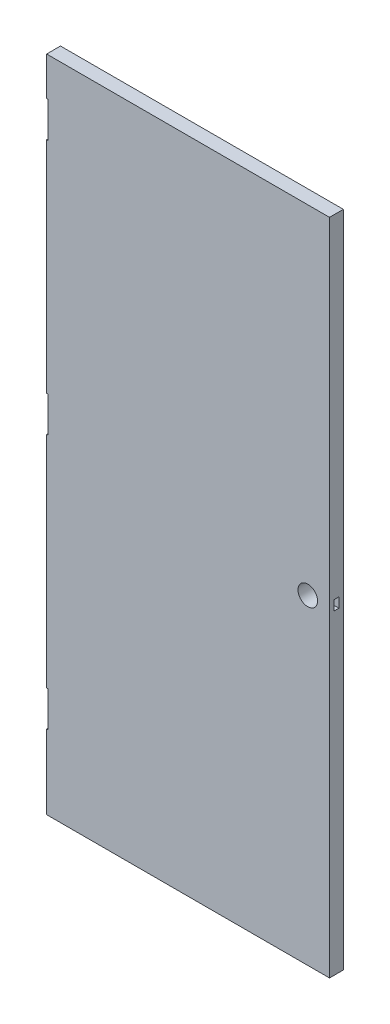
ISO-10303-21;
HEADER;
FILE_DESCRIPTION(('STEP AP214'),'2;1');
FILE_NAME('part.step','',(''),(''),'','','');
FILE_SCHEMA(('AUTOMOTIVE_DESIGN { 1 0 10303 214 1 1 1 1 }'));
ENDSEC;
DATA;
#1=APPLICATION_CONTEXT('core data for automotive mechanical design processes');
#2=APPLICATION_PROTOCOL_DEFINITION('international standard','automotive_design',2000,#1);
#3=PRODUCT_CONTEXT('',#1,'mechanical');
#4=PRODUCT('Part','Part','',(#3));
#5=PRODUCT_RELATED_PRODUCT_CATEGORY('part','',(#4));
#6=PRODUCT_DEFINITION_FORMATION('','',#4);
#7=PRODUCT_DEFINITION_CONTEXT('part definition',#1,'design');
#8=PRODUCT_DEFINITION('design','',#6,#7);
#9=PRODUCT_DEFINITION_SHAPE('','',#8);
#10=(LENGTH_UNIT() NAMED_UNIT(*) SI_UNIT(.MILLI.,.METRE.));
#11=(NAMED_UNIT(*) PLANE_ANGLE_UNIT() SI_UNIT($,.RADIAN.));
#12=(NAMED_UNIT(*) SI_UNIT($,.STERADIAN.) SOLID_ANGLE_UNIT());
#13=UNCERTAINTY_MEASURE_WITH_UNIT(LENGTH_MEASURE(1.E-05),#10,'distance_accuracy_value','');
#14=(GEOMETRIC_REPRESENTATION_CONTEXT(3) GLOBAL_UNCERTAINTY_ASSIGNED_CONTEXT((#13)) GLOBAL_UNIT_ASSIGNED_CONTEXT((#10,
#11,#12)) REPRESENTATION_CONTEXT('',''));
#15=CARTESIAN_POINT('',(0.,0.,0.));
#16=DIRECTION('',(0.,0.,1.));
#17=DIRECTION('',(1.,0.,0.));
#18=AXIS2_PLACEMENT_3D('',#15,#16,#17);
#19=CARTESIAN_POINT('',(454.025,-1057.275,-22.225));
#20=DIRECTION('',(0.,-1.,0.));
#21=DIRECTION('',(1.,0.,0.));
#22=AXIS2_PLACEMENT_3D('',#19,#20,#21);
#23=PLANE('',#22);
#24=DIRECTION('',(0.,0.,1.));
#25=VECTOR('',#24,1.);
#26=CARTESIAN_POINT('',(454.025,-1057.275,-22.225));
#27=LINE('',#26,#25);
#28=CARTESIAN_POINT('',(454.025,-1057.275,-22.225));
#29=VERTEX_POINT('',#28);
#30=CARTESIAN_POINT('',(454.025,-1057.275,22.225));
#31=VERTEX_POINT('',#30);
#32=EDGE_CURVE('E46',#29,#31,#27,.T.);
#33=ORIENTED_EDGE('',*,*,#32,.T.);
#34=DIRECTION('',(1.,0.,0.));
#35=VECTOR('',#34,1.);
#36=CARTESIAN_POINT('',(454.025,-1057.275,22.225));
#37=LINE('',#36,#35);
#38=CARTESIAN_POINT('',(-454.025,-1057.275,22.225));
#39=VERTEX_POINT('',#38);
#40=EDGE_CURVE('E225',#39,#31,#37,.T.);
#41=ORIENTED_EDGE('',*,*,#40,.F.);
#42=DIRECTION('',(0.,0.,1.));
#43=VECTOR('',#42,1.);
#44=CARTESIAN_POINT('',(-454.025,-1057.275,-22.225));
#45=LINE('',#44,#43);
#46=CARTESIAN_POINT('',(-454.025,-1057.275,-22.225));
#47=VERTEX_POINT('',#46);
#48=EDGE_CURVE('E11',#47,#39,#45,.T.);
#49=ORIENTED_EDGE('',*,*,#48,.F.);
#50=DIRECTION('',(1.,0.,0.));
#51=VECTOR('',#50,1.);
#52=CARTESIAN_POINT('',(454.025,-1057.275,-22.225));
#53=LINE('',#52,#51);
#54=EDGE_CURVE('E293',#47,#29,#53,.T.);
#55=ORIENTED_EDGE('',*,*,#54,.T.);
#56=EDGE_LOOP('',(#33,#41,#49,#55));
#57=FACE_BOUND('',#56,.T.);
#58=ADVANCED_FACE('F43',(#57),#23,.T.);
#59=CARTESIAN_POINT('',(-454.025,-1057.275,-22.225));
#60=DIRECTION('',(-1.,0.,0.));
#61=DIRECTION('',(0.,0.,1.));
#62=AXIS2_PLACEMENT_3D('',#59,#60,#61);
#63=PLANE('',#62);
#64=ORIENTED_EDGE('',*,*,#48,.T.);
#65=DIRECTION('',(0.,-1.,0.));
#66=VECTOR('',#65,1.);
#67=CARTESIAN_POINT('',(-454.025,-1057.275,22.225));
#68=LINE('',#67,#66);
#69=CARTESIAN_POINT('',(-454.025,-819.15,22.225));
#70=VERTEX_POINT('',#69);
#71=EDGE_CURVE('E285',#70,#39,#68,.T.);
#72=ORIENTED_EDGE('',*,*,#71,.F.);
#73=DIRECTION('',(0.,0.,1.));
#74=VECTOR('',#73,1.);
#75=CARTESIAN_POINT('',(-454.025,-819.15,-22.225));
#76=LINE('',#75,#74);
#77=CARTESIAN_POINT('',(-454.025,-819.15,-22.225));
#78=VERTEX_POINT('',#77);
#79=EDGE_CURVE('E52',#78,#70,#76,.T.);
#80=ORIENTED_EDGE('',*,*,#79,.F.);
#81=DIRECTION('',(0.,-1.,0.));
#82=VECTOR('',#81,1.);
#83=CARTESIAN_POINT('',(-454.025,-1057.275,-22.225));
#84=LINE('',#83,#82);
#85=EDGE_CURVE('E353',#78,#47,#84,.T.);
#86=ORIENTED_EDGE('',*,*,#85,.T.);
#87=EDGE_LOOP('',(#64,#72,#80,#86));
#88=FACE_BOUND('',#87,.T.);
#89=ADVANCED_FACE('F411',(#88),#63,.T.);
#90=CARTESIAN_POINT('',(-454.025,-819.15,-22.225));
#91=DIRECTION('',(0.,1.,0.));
#92=DIRECTION('',(0.,0.,1.));
#93=AXIS2_PLACEMENT_3D('',#90,#91,#92);
#94=PLANE('',#93);
#95=ORIENTED_EDGE('',*,*,#79,.T.);
#96=DIRECTION('',(-1.,0.,0.));
#97=VECTOR('',#96,1.);
#98=CARTESIAN_POINT('',(-454.025,-819.15,22.225));
#99=LINE('',#98,#97);
#100=CARTESIAN_POINT('',(-449.453,-819.15,22.225));
#101=VERTEX_POINT('',#100);
#102=EDGE_CURVE('E281',#101,#70,#99,.T.);
#103=ORIENTED_EDGE('',*,*,#102,.F.);
#104=DIRECTION('',(0.,0.,1.));
#105=VECTOR('',#104,1.);
#106=CARTESIAN_POINT('',(-449.453,-819.15,-22.225));
#107=LINE('',#106,#105);
#108=CARTESIAN_POINT('',(-449.453,-819.15,-22.225));
#109=VERTEX_POINT('',#108);
#110=EDGE_CURVE('E359',#109,#101,#107,.T.);
#111=ORIENTED_EDGE('',*,*,#110,.F.);
#112=DIRECTION('',(-1.,0.,0.));
#113=VECTOR('',#112,1.);
#114=CARTESIAN_POINT('',(-454.025,-819.15,-22.225));
#115=LINE('',#114,#113);
#116=EDGE_CURVE('E349',#109,#78,#115,.T.);
#117=ORIENTED_EDGE('',*,*,#116,.T.);
#118=EDGE_LOOP('',(#95,#103,#111,#117));
#119=FACE_BOUND('',#118,.T.);
#120=ADVANCED_FACE('F464',(#119),#94,.T.);
#121=CARTESIAN_POINT('',(-449.453,-704.85,-22.225));
#122=DIRECTION('',(-1.,0.,0.));
#123=DIRECTION('',(0.,0.,1.));
#124=AXIS2_PLACEMENT_3D('',#121,#122,#123);
#125=PLANE('',#124);
#126=ORIENTED_EDGE('',*,*,#110,.T.);
#127=DIRECTION('',(0.,-1.,0.));
#128=VECTOR('',#127,1.);
#129=CARTESIAN_POINT('',(-449.453,-704.85,22.225));
#130=LINE('',#129,#128);
#131=CARTESIAN_POINT('',(-449.453,-704.85,22.225));
#132=VERTEX_POINT('',#131);
#133=EDGE_CURVE('E277',#132,#101,#130,.T.);
#134=ORIENTED_EDGE('',*,*,#133,.F.);
#135=DIRECTION('',(0.,0.,1.));
#136=VECTOR('',#135,1.);
#137=CARTESIAN_POINT('',(-449.453,-704.85,-22.225));
#138=LINE('',#137,#136);
#139=CARTESIAN_POINT('',(-449.453,-704.85,-22.225));
#140=VERTEX_POINT('',#139);
#141=EDGE_CURVE('E362',#140,#132,#138,.T.);
#142=ORIENTED_EDGE('',*,*,#141,.F.);
#143=DIRECTION('',(0.,-1.,0.));
#144=VECTOR('',#143,1.);
#145=CARTESIAN_POINT('',(-449.453,-704.85,-22.225));
#146=LINE('',#145,#144);
#147=EDGE_CURVE('E345',#140,#109,#146,.T.);
#148=ORIENTED_EDGE('',*,*,#147,.T.);
#149=EDGE_LOOP('',(#126,#134,#142,#148));
#150=FACE_BOUND('',#149,.T.);
#151=ADVANCED_FACE('F462',(#150),#125,.T.);
#152=CARTESIAN_POINT('',(-454.025,-704.85,-22.225));
#153=DIRECTION('',(0.,-1.,0.));
#154=DIRECTION('',(0.,0.,-1.));
#155=AXIS2_PLACEMENT_3D('',#152,#153,#154);
#156=PLANE('',#155);
#157=ORIENTED_EDGE('',*,*,#141,.T.);
#158=DIRECTION('',(1.,0.,0.));
#159=VECTOR('',#158,1.);
#160=CARTESIAN_POINT('',(-454.025,-704.85,22.225));
#161=LINE('',#160,#159);
#162=CARTESIAN_POINT('',(-454.025,-704.85,22.225));
#163=VERTEX_POINT('',#162);
#164=EDGE_CURVE('E273',#163,#132,#161,.T.);
#165=ORIENTED_EDGE('',*,*,#164,.F.);
#166=DIRECTION('',(0.,0.,1.));
#167=VECTOR('',#166,1.);
#168=CARTESIAN_POINT('',(-454.025,-704.85,-22.225));
#169=LINE('',#168,#167);
#170=CARTESIAN_POINT('',(-454.025,-704.85,-22.225));
#171=VERTEX_POINT('',#170);
#172=EDGE_CURVE('E365',#171,#163,#169,.T.);
#173=ORIENTED_EDGE('',*,*,#172,.F.);
#174=DIRECTION('',(1.,0.,0.));
#175=VECTOR('',#174,1.);
#176=CARTESIAN_POINT('',(-454.025,-704.85,-22.225));
#177=LINE('',#176,#175);
#178=EDGE_CURVE('E341',#171,#140,#177,.T.);
#179=ORIENTED_EDGE('',*,*,#178,.T.);
#180=EDGE_LOOP('',(#157,#165,#173,#179));
#181=FACE_BOUND('',#180,.T.);
#182=ADVANCED_FACE('F460',(#181),#156,.T.);
#183=CARTESIAN_POINT('',(-454.025,-704.85,-22.225));
#184=DIRECTION('',(-1.,0.,0.));
#185=DIRECTION('',(0.,0.,1.));
#186=AXIS2_PLACEMENT_3D('',#183,#184,#185);
#187=PLANE('',#186);
#188=ORIENTED_EDGE('',*,*,#172,.T.);
#189=DIRECTION('',(0.,-1.,0.));
#190=VECTOR('',#189,1.);
#191=CARTESIAN_POINT('',(-454.025,-704.85,22.225));
#192=LINE('',#191,#190);
#193=CARTESIAN_POINT('',(-454.025,0.,22.225));
#194=VERTEX_POINT('',#193);
#195=EDGE_CURVE('E269',#194,#163,#192,.T.);
#196=ORIENTED_EDGE('',*,*,#195,.F.);
#197=DIRECTION('',(0.,0.,1.));
#198=VECTOR('',#197,1.);
#199=CARTESIAN_POINT('',(-454.025,0.,-22.225));
#200=LINE('',#199,#198);
#201=CARTESIAN_POINT('',(-454.025,0.,-22.225));
#202=VERTEX_POINT('',#201);
#203=EDGE_CURVE('E368',#202,#194,#200,.T.);
#204=ORIENTED_EDGE('',*,*,#203,.F.);
#205=DIRECTION('',(0.,-1.,0.));
#206=VECTOR('',#205,1.);
#207=CARTESIAN_POINT('',(-454.025,-704.85,-22.225));
#208=LINE('',#207,#206);
#209=EDGE_CURVE('E337',#202,#171,#208,.T.);
#210=ORIENTED_EDGE('',*,*,#209,.T.);
#211=EDGE_LOOP('',(#188,#196,#204,#210));
#212=FACE_BOUND('',#211,.T.);
#213=ADVANCED_FACE('F455',(#212),#187,.T.);
#214=CARTESIAN_POINT('',(-454.025,0.,-22.225));
#215=DIRECTION('',(0.,1.,0.));
#216=DIRECTION('',(-1.,0.,0.));
#217=AXIS2_PLACEMENT_3D('',#214,#215,#216);
#218=PLANE('',#217);
#219=ORIENTED_EDGE('',*,*,#203,.T.);
#220=DIRECTION('',(-1.,0.,0.));
#221=VECTOR('',#220,1.);
#222=CARTESIAN_POINT('',(-454.025,0.,22.225));
#223=LINE('',#222,#221);
#224=CARTESIAN_POINT('',(-449.453,-1.11022302462516E-13,22.225));
#225=VERTEX_POINT('',#224);
#226=EDGE_CURVE('E265',#225,#194,#223,.T.);
#227=ORIENTED_EDGE('',*,*,#226,.F.);
#228=DIRECTION('',(0.,0.,1.));
#229=VECTOR('',#228,1.);
#230=CARTESIAN_POINT('',(-449.453,-1.11022302462516E-13,-22.225));
#231=LINE('',#230,#229);
#232=CARTESIAN_POINT('',(-449.453,-1.11022302462516E-13,-22.225));
#233=VERTEX_POINT('',#232);
#234=EDGE_CURVE('E371',#233,#225,#231,.T.);
#235=ORIENTED_EDGE('',*,*,#234,.F.);
#236=DIRECTION('',(-1.,0.,0.));
#237=VECTOR('',#236,1.);
#238=CARTESIAN_POINT('',(-454.025,0.,-22.225));
#239=LINE('',#238,#237);
#240=EDGE_CURVE('E333',#233,#202,#239,.T.);
#241=ORIENTED_EDGE('',*,*,#240,.T.);
#242=EDGE_LOOP('',(#219,#227,#235,#241));
#243=FACE_BOUND('',#242,.T.);
#244=ADVANCED_FACE('F450',(#243),#218,.T.);
#245=CARTESIAN_POINT('',(-449.453,114.3,-22.225));
#246=DIRECTION('',(-1.,0.,0.));
#247=DIRECTION('',(0.,0.,1.));
#248=AXIS2_PLACEMENT_3D('',#245,#246,#247);
#249=PLANE('',#248);
#250=ORIENTED_EDGE('',*,*,#234,.T.);
#251=DIRECTION('',(0.,-1.,0.));
#252=VECTOR('',#251,1.);
#253=CARTESIAN_POINT('',(-449.453,114.3,22.225));
#254=LINE('',#253,#252);
#255=CARTESIAN_POINT('',(-449.453,114.3,22.225));
#256=VERTEX_POINT('',#255);
#257=EDGE_CURVE('E261',#256,#225,#254,.T.);
#258=ORIENTED_EDGE('',*,*,#257,.F.);
#259=DIRECTION('',(0.,0.,1.));
#260=VECTOR('',#259,1.);
#261=CARTESIAN_POINT('',(-449.453,114.3,-22.225));
#262=LINE('',#261,#260);
#263=CARTESIAN_POINT('',(-449.453,114.3,-22.225));
#264=VERTEX_POINT('',#263);
#265=EDGE_CURVE('E374',#264,#256,#262,.T.);
#266=ORIENTED_EDGE('',*,*,#265,.F.);
#267=DIRECTION('',(0.,-1.,0.));
#268=VECTOR('',#267,1.);
#269=CARTESIAN_POINT('',(-449.453,114.3,-22.225));
#270=LINE('',#269,#268);
#271=EDGE_CURVE('E329',#264,#233,#270,.T.);
#272=ORIENTED_EDGE('',*,*,#271,.T.);
#273=EDGE_LOOP('',(#250,#258,#266,#272));
#274=FACE_BOUND('',#273,.T.);
#275=ADVANCED_FACE('F448',(#274),#249,.T.);
#276=CARTESIAN_POINT('',(-454.025,114.3,-22.225));
#277=DIRECTION('',(0.,-1.,0.));
#278=DIRECTION('',(0.,0.,-1.));
#279=AXIS2_PLACEMENT_3D('',#276,#277,#278);
#280=PLANE('',#279);
#281=ORIENTED_EDGE('',*,*,#265,.T.);
#282=DIRECTION('',(1.,0.,0.));
#283=VECTOR('',#282,1.);
#284=CARTESIAN_POINT('',(-454.025,114.3,22.225));
#285=LINE('',#284,#283);
#286=CARTESIAN_POINT('',(-454.025,114.3,22.225));
#287=VERTEX_POINT('',#286);
#288=EDGE_CURVE('E257',#287,#256,#285,.T.);
#289=ORIENTED_EDGE('',*,*,#288,.F.);
#290=DIRECTION('',(0.,0.,1.));
#291=VECTOR('',#290,1.);
#292=CARTESIAN_POINT('',(-454.025,114.3,-22.225));
#293=LINE('',#292,#291);
#294=CARTESIAN_POINT('',(-454.025,114.3,-22.225));
#295=VERTEX_POINT('',#294);
#296=EDGE_CURVE('E377',#295,#287,#293,.T.);
#297=ORIENTED_EDGE('',*,*,#296,.F.);
#298=DIRECTION('',(1.,0.,0.));
#299=VECTOR('',#298,1.);
#300=CARTESIAN_POINT('',(-454.025,114.3,-22.225));
#301=LINE('',#300,#299);
#302=EDGE_CURVE('E325',#295,#264,#301,.T.);
#303=ORIENTED_EDGE('',*,*,#302,.T.);
#304=EDGE_LOOP('',(#281,#289,#297,#303));
#305=FACE_BOUND('',#304,.T.);
#306=ADVANCED_FACE('F443',(#305),#280,.T.);
#307=CARTESIAN_POINT('',(-454.025,114.3,-22.225));
#308=DIRECTION('',(-1.,0.,0.));
#309=DIRECTION('',(0.,-1.,0.));
#310=AXIS2_PLACEMENT_3D('',#307,#308,#309);
#311=PLANE('',#310);
#312=ORIENTED_EDGE('',*,*,#296,.T.);
#313=DIRECTION('',(0.,-1.,0.));
#314=VECTOR('',#313,1.);
#315=CARTESIAN_POINT('',(-454.025,114.3,22.225));
#316=LINE('',#315,#314);
#317=CARTESIAN_POINT('',(-454.025,819.15,22.225));
#318=VERTEX_POINT('',#317);
#319=EDGE_CURVE('E253',#318,#287,#316,.T.);
#320=ORIENTED_EDGE('',*,*,#319,.F.);
#321=DIRECTION('',(0.,0.,1.));
#322=VECTOR('',#321,1.);
#323=CARTESIAN_POINT('',(-454.025,819.15,-22.225));
#324=LINE('',#323,#322);
#325=CARTESIAN_POINT('',(-454.025,819.15,-22.225));
#326=VERTEX_POINT('',#325);
#327=EDGE_CURVE('E380',#326,#318,#324,.T.);
#328=ORIENTED_EDGE('',*,*,#327,.F.);
#329=DIRECTION('',(0.,-1.,0.));
#330=VECTOR('',#329,1.);
#331=CARTESIAN_POINT('',(-454.025,114.3,-22.225));
#332=LINE('',#331,#330);
#333=EDGE_CURVE('E321',#326,#295,#332,.T.);
#334=ORIENTED_EDGE('',*,*,#333,.T.);
#335=EDGE_LOOP('',(#312,#320,#328,#334));
#336=FACE_BOUND('',#335,.T.);
#337=ADVANCED_FACE('F438',(#336),#311,.T.);
#338=CARTESIAN_POINT('',(-449.453,819.15,-22.225));
#339=DIRECTION('',(0.,1.,0.));
#340=DIRECTION('',(0.,0.,1.));
#341=AXIS2_PLACEMENT_3D('',#338,#339,#340);
#342=PLANE('',#341);
#343=ORIENTED_EDGE('',*,*,#327,.T.);
#344=DIRECTION('',(-1.,0.,0.));
#345=VECTOR('',#344,1.);
#346=CARTESIAN_POINT('',(-449.453,819.15,22.225));
#347=LINE('',#346,#345);
#348=CARTESIAN_POINT('',(-449.453,819.15,22.225));
#349=VERTEX_POINT('',#348);
#350=EDGE_CURVE('E249',#349,#318,#347,.T.);
#351=ORIENTED_EDGE('',*,*,#350,.F.);
#352=DIRECTION('',(0.,0.,1.));
#353=VECTOR('',#352,1.);
#354=CARTESIAN_POINT('',(-449.453,819.15,-22.225));
#355=LINE('',#354,#353);
#356=CARTESIAN_POINT('',(-449.453,819.15,-22.225));
#357=VERTEX_POINT('',#356);
#358=EDGE_CURVE('E383',#357,#349,#355,.T.);
#359=ORIENTED_EDGE('',*,*,#358,.F.);
#360=DIRECTION('',(-1.,0.,0.));
#361=VECTOR('',#360,1.);
#362=CARTESIAN_POINT('',(-449.453,819.15,-22.225));
#363=LINE('',#362,#361);
#364=EDGE_CURVE('E317',#357,#326,#363,.T.);
#365=ORIENTED_EDGE('',*,*,#364,.T.);
#366=EDGE_LOOP('',(#343,#351,#359,#365));
#367=FACE_BOUND('',#366,.T.);
#368=ADVANCED_FACE('F436',(#367),#342,.T.);
#369=CARTESIAN_POINT('',(-449.453,819.15,-22.225));
#370=DIRECTION('',(-1.,0.,0.));
#371=DIRECTION('',(0.,0.,1.));
#372=AXIS2_PLACEMENT_3D('',#369,#370,#371);
#373=PLANE('',#372);
#374=ORIENTED_EDGE('',*,*,#358,.T.);
#375=DIRECTION('',(0.,-1.,0.));
#376=VECTOR('',#375,1.);
#377=CARTESIAN_POINT('',(-449.453,819.15,22.225));
#378=LINE('',#377,#376);
#379=CARTESIAN_POINT('',(-449.453,933.45,22.225));
#380=VERTEX_POINT('',#379);
#381=EDGE_CURVE('E245',#380,#349,#378,.T.);
#382=ORIENTED_EDGE('',*,*,#381,.F.);
#383=DIRECTION('',(0.,0.,1.));
#384=VECTOR('',#383,1.);
#385=CARTESIAN_POINT('',(-449.453,933.45,-22.225));
#386=LINE('',#385,#384);
#387=CARTESIAN_POINT('',(-449.453,933.45,-22.225));
#388=VERTEX_POINT('',#387);
#389=EDGE_CURVE('E386',#388,#380,#386,.T.);
#390=ORIENTED_EDGE('',*,*,#389,.F.);
#391=DIRECTION('',(0.,-1.,0.));
#392=VECTOR('',#391,1.);
#393=CARTESIAN_POINT('',(-449.453,819.15,-22.225));
#394=LINE('',#393,#392);
#395=EDGE_CURVE('E313',#388,#357,#394,.T.);
#396=ORIENTED_EDGE('',*,*,#395,.T.);
#397=EDGE_LOOP('',(#374,#382,#390,#396));
#398=FACE_BOUND('',#397,.T.);
#399=ADVANCED_FACE('F431',(#398),#373,.T.);
#400=CARTESIAN_POINT('',(-449.453,933.45,-22.225));
#401=DIRECTION('',(0.,-1.,0.));
#402=DIRECTION('',(0.,0.,-1.));
#403=AXIS2_PLACEMENT_3D('',#400,#401,#402);
#404=PLANE('',#403);
#405=ORIENTED_EDGE('',*,*,#389,.T.);
#406=DIRECTION('',(1.,0.,0.));
#407=VECTOR('',#406,1.);
#408=CARTESIAN_POINT('',(-449.453,933.45,22.225));
#409=LINE('',#408,#407);
#410=CARTESIAN_POINT('',(-454.025,933.45,22.225));
#411=VERTEX_POINT('',#410);
#412=EDGE_CURVE('E241',#411,#380,#409,.T.);
#413=ORIENTED_EDGE('',*,*,#412,.F.);
#414=DIRECTION('',(0.,0.,1.));
#415=VECTOR('',#414,1.);
#416=CARTESIAN_POINT('',(-454.025,933.45,-22.225));
#417=LINE('',#416,#415);
#418=CARTESIAN_POINT('',(-454.025,933.45,-22.225));
#419=VERTEX_POINT('',#418);
#420=EDGE_CURVE('E389',#419,#411,#417,.T.);
#421=ORIENTED_EDGE('',*,*,#420,.F.);
#422=DIRECTION('',(1.,0.,0.));
#423=VECTOR('',#422,1.);
#424=CARTESIAN_POINT('',(-449.453,933.45,-22.225));
#425=LINE('',#424,#423);
#426=EDGE_CURVE('E309',#419,#388,#425,.T.);
#427=ORIENTED_EDGE('',*,*,#426,.T.);
#428=EDGE_LOOP('',(#405,#413,#421,#427));
#429=FACE_BOUND('',#428,.T.);
#430=ADVANCED_FACE('F426',(#429),#404,.T.);
#431=CARTESIAN_POINT('',(-454.025,933.45,-22.225));
#432=DIRECTION('',(-1.,0.,0.));
#433=DIRECTION('',(0.,-1.,0.));
#434=AXIS2_PLACEMENT_3D('',#431,#432,#433);
#435=PLANE('',#434);
#436=ORIENTED_EDGE('',*,*,#420,.T.);
#437=DIRECTION('',(0.,-1.,0.));
#438=VECTOR('',#437,1.);
#439=CARTESIAN_POINT('',(-454.025,933.45,22.225));
#440=LINE('',#439,#438);
#441=CARTESIAN_POINT('',(-454.025,1057.275,22.225));
#442=VERTEX_POINT('',#441);
#443=EDGE_CURVE('E237',#442,#411,#440,.T.);
#444=ORIENTED_EDGE('',*,*,#443,.F.);
#445=DIRECTION('',(0.,0.,1.));
#446=VECTOR('',#445,1.);
#447=CARTESIAN_POINT('',(-454.025,1057.275,-22.225));
#448=LINE('',#447,#446);
#449=CARTESIAN_POINT('',(-454.025,1057.275,-22.225));
#450=VERTEX_POINT('',#449);
#451=EDGE_CURVE('E392',#450,#442,#448,.T.);
#452=ORIENTED_EDGE('',*,*,#451,.F.);
#453=DIRECTION('',(0.,-1.,0.));
#454=VECTOR('',#453,1.);
#455=CARTESIAN_POINT('',(-454.025,933.45,-22.225));
#456=LINE('',#455,#454);
#457=EDGE_CURVE('E305',#450,#419,#456,.T.);
#458=ORIENTED_EDGE('',*,*,#457,.T.);
#459=EDGE_LOOP('',(#436,#444,#452,#458));
#460=FACE_BOUND('',#459,.T.);
#461=ADVANCED_FACE('F424',(#460),#435,.T.);
#462=CARTESIAN_POINT('',(454.025,1057.275,-22.225));
#463=DIRECTION('',(0.,1.,0.));
#464=DIRECTION('',(-1.,0.,0.));
#465=AXIS2_PLACEMENT_3D('',#462,#463,#464);
#466=PLANE('',#465);
#467=ORIENTED_EDGE('',*,*,#451,.T.);
#468=DIRECTION('',(-1.,0.,0.));
#469=VECTOR('',#468,1.);
#470=CARTESIAN_POINT('',(454.025,1057.275,22.225));
#471=LINE('',#470,#469);
#472=CARTESIAN_POINT('',(454.025,1057.275,22.225));
#473=VERTEX_POINT('',#472);
#474=EDGE_CURVE('E233',#473,#442,#471,.T.);
#475=ORIENTED_EDGE('',*,*,#474,.F.);
#476=DIRECTION('',(0.,0.,1.));
#477=VECTOR('',#476,1.);
#478=CARTESIAN_POINT('',(454.025,1057.275,-22.225));
#479=LINE('',#478,#477);
#480=CARTESIAN_POINT('',(454.025,1057.275,-22.225));
#481=VERTEX_POINT('',#480);
#482=EDGE_CURVE('E394',#481,#473,#479,.T.);
#483=ORIENTED_EDGE('',*,*,#482,.F.);
#484=DIRECTION('',(-1.,0.,0.));
#485=VECTOR('',#484,1.);
#486=CARTESIAN_POINT('',(454.025,1057.275,-22.225));
#487=LINE('',#486,#485);
#488=EDGE_CURVE('E301',#481,#450,#487,.T.);
#489=ORIENTED_EDGE('',*,*,#488,.T.);
#490=EDGE_LOOP('',(#467,#475,#483,#489));
#491=FACE_BOUND('',#490,.T.);
#492=ADVANCED_FACE('F420',(#491),#466,.T.);
#493=CARTESIAN_POINT('',(454.025,-1057.275,-22.225));
#494=DIRECTION('',(1.,0.,0.));
#495=DIRECTION('',(0.,0.,-1.));
#496=AXIS2_PLACEMENT_3D('',#493,#494,#495);
#497=PLANE('',#496);
#498=DIRECTION('',(0.,0.,1.));
#499=VECTOR('',#498,1.);
#500=CARTESIAN_POINT('',(454.025,-12.85875,-7.858125));
#501=LINE('',#500,#499);
#502=CARTESIAN_POINT('',(454.025,-12.85875,-7.858125));
#503=VERTEX_POINT('',#502);
#504=CARTESIAN_POINT('',(454.025,-12.8587499999999,7.858125));
#505=VERTEX_POINT('',#504);
#506=EDGE_CURVE('E60',#503,#505,#501,.T.);
#507=ORIENTED_EDGE('',*,*,#506,.F.);
#508=DIRECTION('',(0.,1.,0.));
#509=VECTOR('',#508,1.);
#510=CARTESIAN_POINT('',(454.025,-44.29125,-7.858125));
#511=LINE('',#510,#509);
#512=CARTESIAN_POINT('',(454.025,-44.29125,-7.858125));
#513=VERTEX_POINT('',#512);
#514=EDGE_CURVE('E202',#513,#503,#511,.T.);
#515=ORIENTED_EDGE('',*,*,#514,.F.);
#516=DIRECTION('',(0.,0.,-1.));
#517=VECTOR('',#516,1.);
#518=CARTESIAN_POINT('',(454.025,-44.29125,-7.858125));
#519=LINE('',#518,#517);
#520=CARTESIAN_POINT('',(454.025,-44.29125,7.858125));
#521=VERTEX_POINT('',#520);
#522=EDGE_CURVE('E183',#521,#513,#519,.T.);
#523=ORIENTED_EDGE('',*,*,#522,.F.);
#524=DIRECTION('',(0.,-1.,0.));
#525=VECTOR('',#524,1.);
#526=CARTESIAN_POINT('',(454.025,-44.29125,7.858125));
#527=LINE('',#526,#525);
#528=EDGE_CURVE('E192',#505,#521,#527,.T.);
#529=ORIENTED_EDGE('',*,*,#528,.F.);
#530=EDGE_LOOP('',(#507,#515,#523,#529));
#531=FACE_BOUND('',#530,.T.);
#532=ORIENTED_EDGE('',*,*,#482,.T.);
#533=DIRECTION('',(0.,1.,0.));
#534=VECTOR('',#533,1.);
#535=CARTESIAN_POINT('',(454.025,-1057.275,22.225));
#536=LINE('',#535,#534);
#537=EDGE_CURVE('E229',#31,#473,#536,.T.);
#538=ORIENTED_EDGE('',*,*,#537,.F.);
#539=ORIENTED_EDGE('',*,*,#32,.F.);
#540=DIRECTION('',(0.,1.,0.));
#541=VECTOR('',#540,1.);
#542=CARTESIAN_POINT('',(454.025,-1057.275,-22.225));
#543=LINE('',#542,#541);
#544=EDGE_CURVE('E297',#29,#481,#543,.T.);
#545=ORIENTED_EDGE('',*,*,#544,.T.);
#546=EDGE_LOOP('',(#532,#538,#539,#545));
#547=FACE_BOUND('',#546,.T.);
#548=ADVANCED_FACE('F199',(#531,#547),#497,.T.);
#549=CARTESIAN_POINT('',(0.,0.,-22.225));
#550=DIRECTION('',(0.,0.,-1.));
#551=DIRECTION('',(-1.,0.,0.));
#552=AXIS2_PLACEMENT_3D('',#549,#550,#551);
#553=PLANE('',#552);
#554=CARTESIAN_POINT('',(384.175,-28.575,-22.225));
#555=DIRECTION('',(0.,0.,1.));
#556=DIRECTION('',(1.,0.,0.));
#557=AXIS2_PLACEMENT_3D('',#554,#555,#556);
#558=CIRCLE('',#557,31.4325);
#559=CARTESIAN_POINT('',(415.6075,-28.575,-22.225));
#560=VERTEX_POINT('',#559);
#561=EDGE_CURVE('E289',#560,#560,#558,.T.);
#562=ORIENTED_EDGE('',*,*,#561,.T.);
#563=EDGE_LOOP('',(#562));
#564=FACE_BOUND('',#563,.T.);
#565=ORIENTED_EDGE('',*,*,#54,.F.);
#566=ORIENTED_EDGE('',*,*,#85,.F.);
#567=ORIENTED_EDGE('',*,*,#116,.F.);
#568=ORIENTED_EDGE('',*,*,#147,.F.);
#569=ORIENTED_EDGE('',*,*,#178,.F.);
#570=ORIENTED_EDGE('',*,*,#209,.F.);
#571=ORIENTED_EDGE('',*,*,#240,.F.);
#572=ORIENTED_EDGE('',*,*,#271,.F.);
#573=ORIENTED_EDGE('',*,*,#302,.F.);
#574=ORIENTED_EDGE('',*,*,#333,.F.);
#575=ORIENTED_EDGE('',*,*,#364,.F.);
#576=ORIENTED_EDGE('',*,*,#395,.F.);
#577=ORIENTED_EDGE('',*,*,#426,.F.);
#578=ORIENTED_EDGE('',*,*,#457,.F.);
#579=ORIENTED_EDGE('',*,*,#488,.F.);
#580=ORIENTED_EDGE('',*,*,#544,.F.);
#581=EDGE_LOOP('',(#565,#566,#567,#568,#569,#570,#571,#572,#573,#574,#575,#576,#577,#578,#579,#580));
#582=FACE_BOUND('',#581,.T.);
#583=ADVANCED_FACE('F414',(#564,#582),#553,.T.);
#584=CARTESIAN_POINT('',(384.175,-28.575,-22.225));
#585=DIRECTION('',(0.,0.,1.));
#586=DIRECTION('',(1.,0.,0.));
#587=AXIS2_PLACEMENT_3D('',#584,#585,#586);
#588=CYLINDRICAL_SURFACE('',#587,31.4325);
#589=CARTESIAN_POINT('',(384.175,-28.575,-7.858125));
#590=DIRECTION('',(0.,0.,-1.));
#591=DIRECTION('',(-1.,0.,0.));
#592=AXIS2_PLACEMENT_3D('',#589,#590,#591);
#593=CIRCLE('',#592,31.4325);
#594=CARTESIAN_POINT('',(411.396343504454,-12.85875,-7.858125));
#595=VERTEX_POINT('',#594);
#596=CARTESIAN_POINT('',(411.396343504454,-44.29125,-7.858125));
#597=VERTEX_POINT('',#596);
#598=EDGE_CURVE('E653',#595,#597,#593,.T.);
#599=ORIENTED_EDGE('',*,*,#598,.F.);
#600=DIRECTION('',(0.,0.,1.));
#601=VECTOR('',#600,1.);
#602=CARTESIAN_POINT('',(411.396343504454,-12.85875,-22.225));
#603=LINE('',#602,#601);
#604=CARTESIAN_POINT('',(411.396343504454,-12.85875,7.858125));
#605=VERTEX_POINT('',#604);
#606=EDGE_CURVE('E657',#605,#595,#603,.F.);
#607=ORIENTED_EDGE('',*,*,#606,.F.);
#608=CARTESIAN_POINT('',(384.175,-28.575,7.858125));
#609=DIRECTION('',(0.,0.,1.));
#610=DIRECTION('',(1.,0.,0.));
#611=AXIS2_PLACEMENT_3D('',#608,#609,#610);
#612=CIRCLE('',#611,31.4325);
#613=CARTESIAN_POINT('',(411.396343504454,-44.29125,7.858125));
#614=VERTEX_POINT('',#613);
#615=EDGE_CURVE('E197',#614,#605,#612,.T.);
#616=ORIENTED_EDGE('',*,*,#615,.F.);
#617=DIRECTION('',(0.,0.,1.));
#618=VECTOR('',#617,1.);
#619=CARTESIAN_POINT('',(411.396343504454,-44.29125,-22.225));
#620=LINE('',#619,#618);
#621=EDGE_CURVE('E68',#597,#614,#620,.T.);
#622=ORIENTED_EDGE('',*,*,#621,.F.);
#623=EDGE_LOOP('',(#599,#607,#616,#622));
#624=FACE_BOUND('',#623,.T.);
#625=ORIENTED_EDGE('',*,*,#561,.F.);
#626=EDGE_LOOP('',(#625));
#627=FACE_BOUND('',#626,.T.);
#628=CARTESIAN_POINT('',(384.175,-28.575,22.225));
#629=DIRECTION('',(0.,0.,1.));
#630=DIRECTION('',(1.,0.,0.));
#631=AXIS2_PLACEMENT_3D('',#628,#629,#630);
#632=CIRCLE('',#631,31.4325);
#633=CARTESIAN_POINT('',(415.6075,-28.575,22.225));
#634=VERTEX_POINT('',#633);
#635=EDGE_CURVE('E221',#634,#634,#632,.T.);
#636=ORIENTED_EDGE('',*,*,#635,.T.);
#637=EDGE_LOOP('',(#636));
#638=FACE_BOUND('',#637,.T.);
#639=ADVANCED_FACE('F589',(#624,#627,#638),#588,.F.);
#640=CARTESIAN_POINT('',(0.,0.,22.225));
#641=DIRECTION('',(0.,0.,-1.));
#642=DIRECTION('',(-1.,0.,0.));
#643=AXIS2_PLACEMENT_3D('',#640,#641,#642);
#644=PLANE('',#643);
#645=ORIENTED_EDGE('',*,*,#40,.T.);
#646=ORIENTED_EDGE('',*,*,#537,.T.);
#647=ORIENTED_EDGE('',*,*,#474,.T.);
#648=ORIENTED_EDGE('',*,*,#443,.T.);
#649=ORIENTED_EDGE('',*,*,#412,.T.);
#650=ORIENTED_EDGE('',*,*,#381,.T.);
#651=ORIENTED_EDGE('',*,*,#350,.T.);
#652=ORIENTED_EDGE('',*,*,#319,.T.);
#653=ORIENTED_EDGE('',*,*,#288,.T.);
#654=ORIENTED_EDGE('',*,*,#257,.T.);
#655=ORIENTED_EDGE('',*,*,#226,.T.);
#656=ORIENTED_EDGE('',*,*,#195,.T.);
#657=ORIENTED_EDGE('',*,*,#164,.T.);
#658=ORIENTED_EDGE('',*,*,#133,.T.);
#659=ORIENTED_EDGE('',*,*,#102,.T.);
#660=ORIENTED_EDGE('',*,*,#71,.T.);
#661=EDGE_LOOP('',(#645,#646,#647,#648,#649,#650,#651,#652,#653,#654,#655,#656,#657,#658,#659,#660));
#662=FACE_BOUND('',#661,.T.);
#663=ORIENTED_EDGE('',*,*,#635,.F.);
#664=EDGE_LOOP('',(#663));
#665=FACE_BOUND('',#664,.T.);
#666=ADVANCED_FACE('F406',(#662,#665),#644,.F.);
#667=CARTESIAN_POINT('',(-454.026,-12.85875,-7.858125));
#668=DIRECTION('',(0.,1.,0.));
#669=DIRECTION('',(0.,0.,1.));
#670=AXIS2_PLACEMENT_3D('',#667,#668,#669);
#671=PLANE('',#670);
#672=ORIENTED_EDGE('',*,*,#606,.T.);
#673=DIRECTION('',(1.,0.,0.));
#674=VECTOR('',#673,1.);
#675=CARTESIAN_POINT('',(-454.026,-12.85875,-7.858125));
#676=LINE('',#675,#674);
#677=EDGE_CURVE('E214',#595,#503,#676,.T.);
#678=ORIENTED_EDGE('',*,*,#677,.T.);
#679=ORIENTED_EDGE('',*,*,#506,.T.);
#680=DIRECTION('',(1.,0.,0.));
#681=VECTOR('',#680,1.);
#682=CARTESIAN_POINT('',(-454.026,-12.85875,7.858125));
#683=LINE('',#682,#681);
#684=EDGE_CURVE('E194',#605,#505,#683,.T.);
#685=ORIENTED_EDGE('',*,*,#684,.F.);
#686=EDGE_LOOP('',(#672,#678,#679,#685));
#687=FACE_BOUND('',#686,.T.);
#688=ADVANCED_FACE('F601',(#687),#671,.F.);
#689=CARTESIAN_POINT('',(-454.026,-44.29125,-7.858125));
#690=DIRECTION('',(0.,0.,-1.));
#691=DIRECTION('',(-1.,0.,0.));
#692=AXIS2_PLACEMENT_3D('',#689,#690,#691);
#693=PLANE('',#692);
#694=ORIENTED_EDGE('',*,*,#598,.T.);
#695=DIRECTION('',(1.,0.,0.));
#696=VECTOR('',#695,1.);
#697=CARTESIAN_POINT('',(-454.026,-44.29125,-7.858125));
#698=LINE('',#697,#696);
#699=EDGE_CURVE('E189',#597,#513,#698,.T.);
#700=ORIENTED_EDGE('',*,*,#699,.T.);
#701=ORIENTED_EDGE('',*,*,#514,.T.);
#702=ORIENTED_EDGE('',*,*,#677,.F.);
#703=EDGE_LOOP('',(#694,#700,#701,#702));
#704=FACE_BOUND('',#703,.T.);
#705=ADVANCED_FACE('F622',(#704),#693,.F.);
#706=CARTESIAN_POINT('',(-454.026,-44.29125,-7.858125));
#707=DIRECTION('',(0.,-1.,0.));
#708=DIRECTION('',(0.,0.,-1.));
#709=AXIS2_PLACEMENT_3D('',#706,#707,#708);
#710=PLANE('',#709);
#711=ORIENTED_EDGE('',*,*,#621,.T.);
#712=DIRECTION('',(1.,0.,0.));
#713=VECTOR('',#712,1.);
#714=CARTESIAN_POINT('',(-454.026,-44.29125,7.858125));
#715=LINE('',#714,#713);
#716=EDGE_CURVE('E179',#614,#521,#715,.T.);
#717=ORIENTED_EDGE('',*,*,#716,.T.);
#718=ORIENTED_EDGE('',*,*,#522,.T.);
#719=ORIENTED_EDGE('',*,*,#699,.F.);
#720=EDGE_LOOP('',(#711,#717,#718,#719));
#721=FACE_BOUND('',#720,.T.);
#722=ADVANCED_FACE('F181',(#721),#710,.F.);
#723=CARTESIAN_POINT('',(-454.026,-44.29125,7.858125));
#724=DIRECTION('',(0.,0.,1.));
#725=DIRECTION('',(1.,0.,0.));
#726=AXIS2_PLACEMENT_3D('',#723,#724,#725);
#727=PLANE('',#726);
#728=ORIENTED_EDGE('',*,*,#615,.T.);
#729=ORIENTED_EDGE('',*,*,#684,.T.);
#730=ORIENTED_EDGE('',*,*,#528,.T.);
#731=ORIENTED_EDGE('',*,*,#716,.F.);
#732=EDGE_LOOP('',(#728,#729,#730,#731));
#733=FACE_BOUND('',#732,.T.);
#734=ADVANCED_FACE('F193',(#733),#727,.F.);
#735=CLOSED_SHELL('',(#58,#89,#120,#151,#182,#213,#244,#275,#306,#337,#368,#399,#430,#461,#492,
#548,#583,#639,#666,#688,#705,#722,#734));
#736=MANIFOLD_SOLID_BREP('B2',#735);
#737=ADVANCED_BREP_SHAPE_REPRESENTATION('',(#18,#736),#14);
#738=SHAPE_DEFINITION_REPRESENTATION(#9,#737);
ENDSEC;
END-ISO-10303-21;
